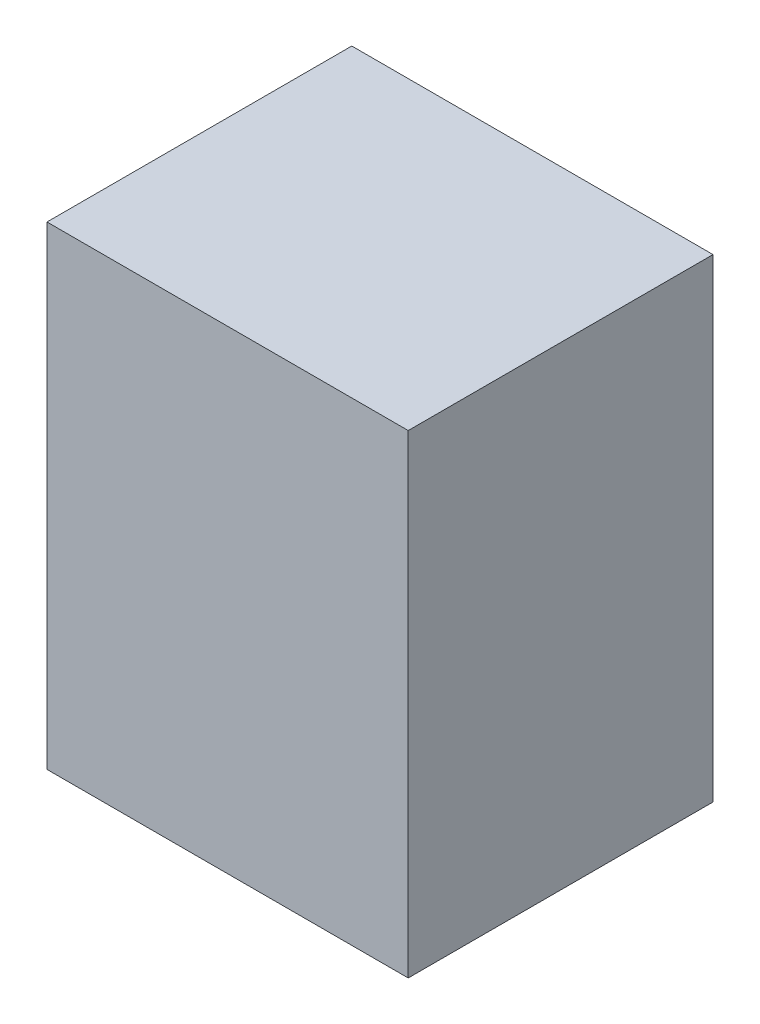
ISO-10303-21;
HEADER;
FILE_DESCRIPTION(('STEP AP214'),'2;1');
FILE_NAME('part.step','',(''),(''),'','','');
FILE_SCHEMA(('AUTOMOTIVE_DESIGN { 1 0 10303 214 1 1 1 1 }'));
ENDSEC;
DATA;
#1=APPLICATION_CONTEXT('core data for automotive mechanical design processes');
#2=APPLICATION_PROTOCOL_DEFINITION('international standard','automotive_design',2000,#1);
#3=PRODUCT_CONTEXT('',#1,'mechanical');
#4=PRODUCT('Part','Part','',(#3));
#5=PRODUCT_RELATED_PRODUCT_CATEGORY('part','',(#4));
#6=PRODUCT_DEFINITION_FORMATION('','',#4);
#7=PRODUCT_DEFINITION_CONTEXT('part definition',#1,'design');
#8=PRODUCT_DEFINITION('design','',#6,#7);
#9=PRODUCT_DEFINITION_SHAPE('','',#8);
#10=(LENGTH_UNIT() NAMED_UNIT(*) SI_UNIT(.MILLI.,.METRE.));
#11=(NAMED_UNIT(*) PLANE_ANGLE_UNIT() SI_UNIT($,.RADIAN.));
#12=(NAMED_UNIT(*) SI_UNIT($,.STERADIAN.) SOLID_ANGLE_UNIT());
#13=UNCERTAINTY_MEASURE_WITH_UNIT(LENGTH_MEASURE(1.E-05),#10,'distance_accuracy_value','');
#14=(GEOMETRIC_REPRESENTATION_CONTEXT(3) GLOBAL_UNCERTAINTY_ASSIGNED_CONTEXT((#13)) GLOBAL_UNIT_ASSIGNED_CONTEXT((#10,
#11,#12)) REPRESENTATION_CONTEXT('',''));
#15=CARTESIAN_POINT('',(0.,0.,0.));
#16=DIRECTION('',(0.,0.,1.));
#17=DIRECTION('',(1.,0.,0.));
#18=AXIS2_PLACEMENT_3D('',#15,#16,#17);
#19=CARTESIAN_POINT('',(-18.1,-28.4,13.5));
#20=DIRECTION('',(-1.,0.,0.));
#21=DIRECTION('',(0.,-1.,0.));
#22=AXIS2_PLACEMENT_3D('',#19,#20,#21);
#23=PLANE('',#22);
#24=DIRECTION('',(0.,1.,0.));
#25=VECTOR('',#24,1.);
#26=CARTESIAN_POINT('',(-18.1,-28.4,0.));
#27=LINE('',#26,#25);
#28=CARTESIAN_POINT('',(-18.1,-49.4,0.));
#29=VERTEX_POINT('',#28);
#30=CARTESIAN_POINT('',(-18.1,-28.4,0.));
#31=VERTEX_POINT('',#30);
#32=EDGE_CURVE('E96',#29,#31,#27,.T.);
#33=ORIENTED_EDGE('',*,*,#32,.T.);
#34=DIRECTION('',(0.,0.,-1.));
#35=VECTOR('',#34,1.);
#36=CARTESIAN_POINT('',(-18.1,-28.4,13.5));
#37=LINE('',#36,#35);
#38=CARTESIAN_POINT('',(-18.1,-28.4,13.5));
#39=VERTEX_POINT('',#38);
#40=EDGE_CURVE('E11',#39,#31,#37,.T.);
#41=ORIENTED_EDGE('',*,*,#40,.F.);
#42=DIRECTION('',(0.,1.,0.));
#43=VECTOR('',#42,1.);
#44=CARTESIAN_POINT('',(-18.1,-28.4,13.5));
#45=LINE('',#44,#43);
#46=CARTESIAN_POINT('',(-18.1,-49.4,13.5));
#47=VERTEX_POINT('',#46);
#48=EDGE_CURVE('E84',#47,#39,#45,.T.);
#49=ORIENTED_EDGE('',*,*,#48,.F.);
#50=DIRECTION('',(0.,0.,-1.));
#51=VECTOR('',#50,1.);
#52=CARTESIAN_POINT('',(-18.1,-49.4,13.5));
#53=LINE('',#52,#51);
#54=EDGE_CURVE('E92',#47,#29,#53,.T.);
#55=ORIENTED_EDGE('',*,*,#54,.T.);
#56=EDGE_LOOP('',(#33,#41,#49,#55));
#57=FACE_BOUND('',#56,.T.);
#58=ADVANCED_FACE('F33',(#57),#23,.F.);
#59=CARTESIAN_POINT('',(-34.1,-28.4,13.5));
#60=DIRECTION('',(0.,-1.,0.));
#61=DIRECTION('',(0.,0.,-1.));
#62=AXIS2_PLACEMENT_3D('',#59,#60,#61);
#63=PLANE('',#62);
#64=DIRECTION('',(-1.,0.,0.));
#65=VECTOR('',#64,1.);
#66=CARTESIAN_POINT('',(-34.1,-28.4,0.));
#67=LINE('',#66,#65);
#68=CARTESIAN_POINT('',(-34.1,-28.4,0.));
#69=VERTEX_POINT('',#68);
#70=EDGE_CURVE('E88',#31,#69,#67,.T.);
#71=ORIENTED_EDGE('',*,*,#70,.T.);
#72=DIRECTION('',(0.,0.,-1.));
#73=VECTOR('',#72,1.);
#74=CARTESIAN_POINT('',(-34.1,-28.4,13.5));
#75=LINE('',#74,#73);
#76=CARTESIAN_POINT('',(-34.1,-28.4,13.5));
#77=VERTEX_POINT('',#76);
#78=EDGE_CURVE('E41',#77,#69,#75,.T.);
#79=ORIENTED_EDGE('',*,*,#78,.F.);
#80=DIRECTION('',(-1.,0.,0.));
#81=VECTOR('',#80,1.);
#82=CARTESIAN_POINT('',(-34.1,-28.4,13.5));
#83=LINE('',#82,#81);
#84=EDGE_CURVE('E79',#39,#77,#83,.T.);
#85=ORIENTED_EDGE('',*,*,#84,.F.);
#86=ORIENTED_EDGE('',*,*,#40,.T.);
#87=EDGE_LOOP('',(#71,#79,#85,#86));
#88=FACE_BOUND('',#87,.T.);
#89=ADVANCED_FACE('F87',(#88),#63,.F.);
#90=CARTESIAN_POINT('',(-34.1,-28.4,13.5));
#91=DIRECTION('',(1.,0.,0.));
#92=DIRECTION('',(0.,1.,0.));
#93=AXIS2_PLACEMENT_3D('',#90,#91,#92);
#94=PLANE('',#93);
#95=DIRECTION('',(0.,-1.,0.));
#96=VECTOR('',#95,1.);
#97=CARTESIAN_POINT('',(-34.1,-28.4,0.));
#98=LINE('',#97,#96);
#99=CARTESIAN_POINT('',(-34.1,-49.4,0.));
#100=VERTEX_POINT('',#99);
#101=EDGE_CURVE('E66',#69,#100,#98,.T.);
#102=ORIENTED_EDGE('',*,*,#101,.T.);
#103=DIRECTION('',(0.,0.,-1.));
#104=VECTOR('',#103,1.);
#105=CARTESIAN_POINT('',(-34.1,-49.4,13.5));
#106=LINE('',#105,#104);
#107=CARTESIAN_POINT('',(-34.1,-49.4,13.5));
#108=VERTEX_POINT('',#107);
#109=EDGE_CURVE('E89',#108,#100,#106,.T.);
#110=ORIENTED_EDGE('',*,*,#109,.F.);
#111=DIRECTION('',(0.,-1.,0.));
#112=VECTOR('',#111,1.);
#113=CARTESIAN_POINT('',(-34.1,-28.4,13.5));
#114=LINE('',#113,#112);
#115=EDGE_CURVE('E82',#77,#108,#114,.T.);
#116=ORIENTED_EDGE('',*,*,#115,.F.);
#117=ORIENTED_EDGE('',*,*,#78,.T.);
#118=EDGE_LOOP('',(#102,#110,#116,#117));
#119=FACE_BOUND('',#118,.T.);
#120=ADVANCED_FACE('F90',(#119),#94,.F.);
#121=CARTESIAN_POINT('',(-34.1,-49.4,13.5));
#122=DIRECTION('',(0.,1.,0.));
#123=DIRECTION('',(0.,0.,1.));
#124=AXIS2_PLACEMENT_3D('',#121,#122,#123);
#125=PLANE('',#124);
#126=DIRECTION('',(1.,0.,0.));
#127=VECTOR('',#126,1.);
#128=CARTESIAN_POINT('',(-34.1,-49.4,0.));
#129=LINE('',#128,#127);
#130=EDGE_CURVE('E72',#100,#29,#129,.T.);
#131=ORIENTED_EDGE('',*,*,#130,.T.);
#132=ORIENTED_EDGE('',*,*,#54,.F.);
#133=DIRECTION('',(1.,0.,0.));
#134=VECTOR('',#133,1.);
#135=CARTESIAN_POINT('',(-34.1,-49.4,13.5));
#136=LINE('',#135,#134);
#137=EDGE_CURVE('E49',#108,#47,#136,.T.);
#138=ORIENTED_EDGE('',*,*,#137,.F.);
#139=ORIENTED_EDGE('',*,*,#109,.T.);
#140=EDGE_LOOP('',(#131,#132,#138,#139));
#141=FACE_BOUND('',#140,.T.);
#142=ADVANCED_FACE('F103',(#141),#125,.F.);
#143=CARTESIAN_POINT('',(0.,0.,13.5));
#144=DIRECTION('',(0.,0.,1.));
#145=DIRECTION('',(1.,0.,0.));
#146=AXIS2_PLACEMENT_3D('',#143,#144,#145);
#147=PLANE('',#146);
#148=ORIENTED_EDGE('',*,*,#48,.T.);
#149=ORIENTED_EDGE('',*,*,#84,.T.);
#150=ORIENTED_EDGE('',*,*,#115,.T.);
#151=ORIENTED_EDGE('',*,*,#137,.T.);
#152=EDGE_LOOP('',(#148,#149,#150,#151));
#153=FACE_BOUND('',#152,.T.);
#154=ADVANCED_FACE('F80',(#153),#147,.T.);
#155=CARTESIAN_POINT('',(0.,0.,0.));
#156=DIRECTION('',(0.,0.,1.));
#157=DIRECTION('',(1.,0.,0.));
#158=AXIS2_PLACEMENT_3D('',#155,#156,#157);
#159=PLANE('',#158);
#160=ORIENTED_EDGE('',*,*,#32,.F.);
#161=ORIENTED_EDGE('',*,*,#130,.F.);
#162=ORIENTED_EDGE('',*,*,#101,.F.);
#163=ORIENTED_EDGE('',*,*,#70,.F.);
#164=EDGE_LOOP('',(#160,#161,#162,#163));
#165=FACE_BOUND('',#164,.T.);
#166=ADVANCED_FACE('F106',(#165),#159,.F.);
#167=CLOSED_SHELL('',(#58,#89,#120,#142,#154,#166));
#168=MANIFOLD_SOLID_BREP('B2',#167);
#169=ADVANCED_BREP_SHAPE_REPRESENTATION('',(#18,#168),#14);
#170=SHAPE_DEFINITION_REPRESENTATION(#9,#169);
ENDSEC;
END-ISO-10303-21;
